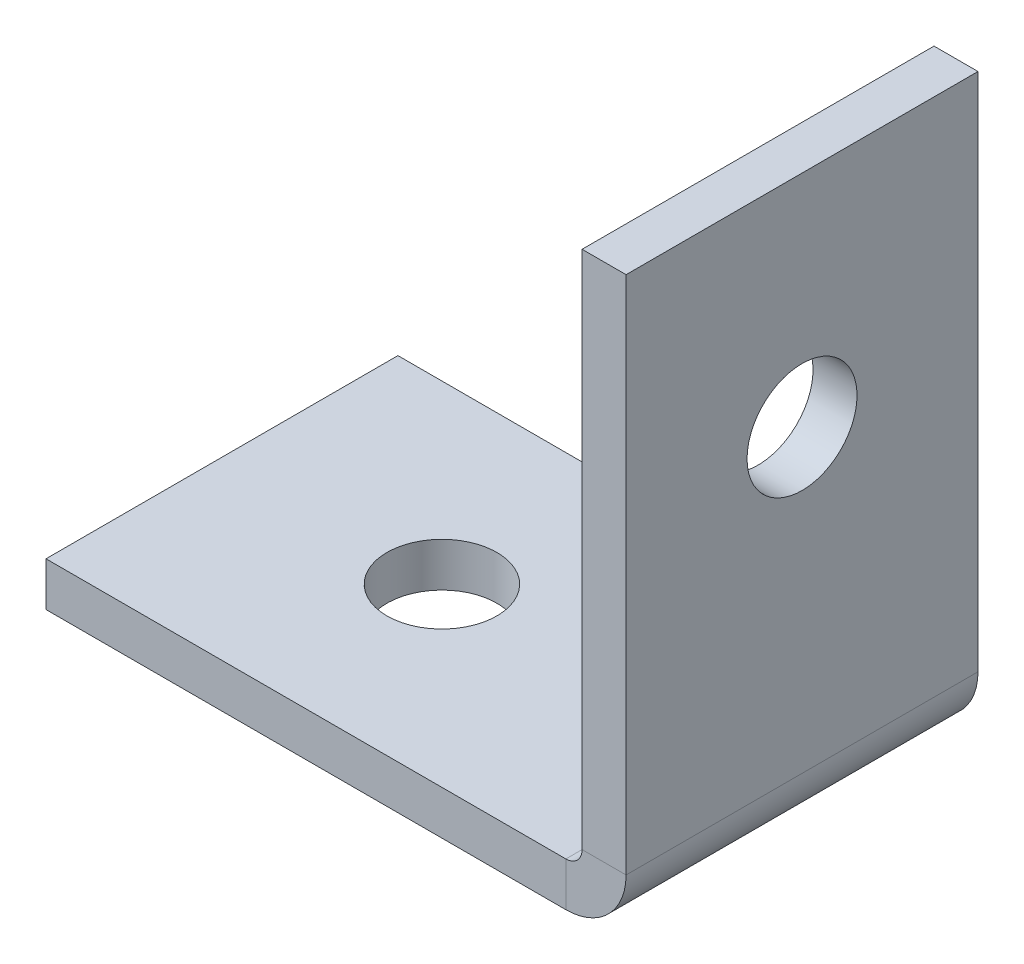
ISO-10303-21;
HEADER;
FILE_DESCRIPTION(('STEP AP214'),'2;1');
FILE_NAME('part.step','',(''),(''),'','','');
FILE_SCHEMA(('AUTOMOTIVE_DESIGN { 1 0 10303 214 1 1 1 1 }'));
ENDSEC;
DATA;
#1=APPLICATION_CONTEXT('core data for automotive mechanical design processes');
#2=APPLICATION_PROTOCOL_DEFINITION('international standard','automotive_design',2000,#1);
#3=PRODUCT_CONTEXT('',#1,'mechanical');
#4=PRODUCT('Part','Part','',(#3));
#5=PRODUCT_RELATED_PRODUCT_CATEGORY('part','',(#4));
#6=PRODUCT_DEFINITION_FORMATION('','',#4);
#7=PRODUCT_DEFINITION_CONTEXT('part definition',#1,'design');
#8=PRODUCT_DEFINITION('design','',#6,#7);
#9=PRODUCT_DEFINITION_SHAPE('','',#8);
#10=(LENGTH_UNIT() NAMED_UNIT(*) SI_UNIT(.MILLI.,.METRE.));
#11=(NAMED_UNIT(*) PLANE_ANGLE_UNIT() SI_UNIT($,.RADIAN.));
#12=(NAMED_UNIT(*) SI_UNIT($,.STERADIAN.) SOLID_ANGLE_UNIT());
#13=UNCERTAINTY_MEASURE_WITH_UNIT(LENGTH_MEASURE(1.E-05),#10,'distance_accuracy_value','');
#14=(GEOMETRIC_REPRESENTATION_CONTEXT(3) GLOBAL_UNCERTAINTY_ASSIGNED_CONTEXT((#13)) GLOBAL_UNIT_ASSIGNED_CONTEXT((#10,
#11,#12)) REPRESENTATION_CONTEXT('',''));
#15=CARTESIAN_POINT('',(0.,0.,0.));
#16=DIRECTION('',(0.,0.,1.));
#17=DIRECTION('',(1.,0.,0.));
#18=AXIS2_PLACEMENT_3D('',#15,#16,#17);
#19=CARTESIAN_POINT('',(-0.627322450556003,-0.627322450556014,0.));
#20=DIRECTION('',(1.,0.,0.));
#21=DIRECTION('',(0.,0.,-1.));
#22=AXIS2_PLACEMENT_3D('',#19,#20,#21);
#23=PLANE('',#22);
#24=CARTESIAN_POINT('',(-0.627322450556055,14.372677549444,0.));
#25=DIRECTION('',(-1.,0.,0.));
#26=DIRECTION('',(0.,0.,1.));
#27=AXIS2_PLACEMENT_3D('',#24,#25,#26);
#28=CIRCLE('',#27,2.5);
#29=CARTESIAN_POINT('',(-0.627322450556055,14.372677549444,2.5));
#30=VERTEX_POINT('',#29);
#31=EDGE_CURVE('E168',#30,#30,#28,.T.);
#32=ORIENTED_EDGE('',*,*,#31,.F.);
#33=EDGE_LOOP('',(#32));
#34=FACE_BOUND('',#33,.T.);
#35=DIRECTION('',(0.,-1.,0.));
#36=VECTOR('',#35,1.);
#37=CARTESIAN_POINT('',(-0.627322450555915,-25.627322450556,-8.00000000000001));
#38=LINE('',#37,#36);
#39=CARTESIAN_POINT('',(-0.62732245055609,24.372677549444,-8.00000000000001));
#40=VERTEX_POINT('',#39);
#41=CARTESIAN_POINT('',(-0.627322450556007,0.736600000000003,-8.00000000000001));
#42=VERTEX_POINT('',#41);
#43=EDGE_CURVE('E64',#40,#42,#38,.T.);
#44=ORIENTED_EDGE('',*,*,#43,.T.);
#45=DIRECTION('',(0.,0.,1.));
#46=VECTOR('',#45,1.);
#47=CARTESIAN_POINT('',(-0.627322450556007,0.736600000000001,0.));
#48=LINE('',#47,#46);
#49=CARTESIAN_POINT('',(-0.627322450556007,0.736600000000003,7.99999999999999));
#50=VERTEX_POINT('',#49);
#51=EDGE_CURVE('E56',#42,#50,#48,.T.);
#52=ORIENTED_EDGE('',*,*,#51,.T.);
#53=DIRECTION('',(0.,1.,0.));
#54=VECTOR('',#53,1.);
#55=CARTESIAN_POINT('',(-0.627322450555915,-25.627322450556,7.99999999999999));
#56=LINE('',#55,#54);
#57=CARTESIAN_POINT('',(-0.62732245055609,24.372677549444,7.99999999999999));
#58=VERTEX_POINT('',#57);
#59=EDGE_CURVE('E72',#50,#58,#56,.T.);
#60=ORIENTED_EDGE('',*,*,#59,.T.);
#61=DIRECTION('',(0.,0.,-1.));
#62=VECTOR('',#61,1.);
#63=CARTESIAN_POINT('',(-0.62732245055609,24.372677549444,7.99999999999999));
#64=LINE('',#63,#62);
#65=EDGE_CURVE('E167',#58,#40,#64,.T.);
#66=ORIENTED_EDGE('',*,*,#65,.T.);
#67=EDGE_LOOP('',(#44,#52,#60,#66));
#68=FACE_BOUND('',#67,.T.);
#69=ADVANCED_FACE('F47',(#34,#68),#23,.F.);
#70=CARTESIAN_POINT('',(1.37267754944391,24.372677549444,7.99999999999999));
#71=DIRECTION('',(0.,1.,0.));
#72=DIRECTION('',(0.,0.,-1.));
#73=AXIS2_PLACEMENT_3D('',#70,#71,#72);
#74=PLANE('',#73);
#75=ORIENTED_EDGE('',*,*,#65,.F.);
#76=DIRECTION('',(-1.,0.,0.));
#77=VECTOR('',#76,1.);
#78=CARTESIAN_POINT('',(1.37267754944391,24.372677549444,7.99999999999999));
#79=LINE('',#78,#77);
#80=CARTESIAN_POINT('',(1.37267754944391,24.372677549444,7.99999999999999));
#81=VERTEX_POINT('',#80);
#82=EDGE_CURVE('E177',#81,#58,#79,.T.);
#83=ORIENTED_EDGE('',*,*,#82,.F.);
#84=DIRECTION('',(0.,0.,-1.));
#85=VECTOR('',#84,1.);
#86=CARTESIAN_POINT('',(1.37267754944391,24.372677549444,7.99999999999999));
#87=LINE('',#86,#85);
#88=CARTESIAN_POINT('',(1.37267754944391,24.372677549444,-8.00000000000001));
#89=VERTEX_POINT('',#88);
#90=EDGE_CURVE('E172',#81,#89,#87,.T.);
#91=ORIENTED_EDGE('',*,*,#90,.T.);
#92=DIRECTION('',(-1.,0.,0.));
#93=VECTOR('',#92,1.);
#94=CARTESIAN_POINT('',(1.37267754944391,24.372677549444,-8.00000000000001));
#95=LINE('',#94,#93);
#96=EDGE_CURVE('E179',#89,#40,#95,.T.);
#97=ORIENTED_EDGE('',*,*,#96,.T.);
#98=EDGE_LOOP('',(#75,#83,#91,#97));
#99=FACE_BOUND('',#98,.T.);
#100=ADVANCED_FACE('F194',(#99),#74,.T.);
#101=CARTESIAN_POINT('',(1.37267754944408,-25.627322450556,7.99999999999999));
#102=DIRECTION('',(0.,0.,1.));
#103=DIRECTION('',(0.,1.,0.));
#104=AXIS2_PLACEMENT_3D('',#101,#102,#103);
#105=PLANE('',#104);
#106=DIRECTION('',(-1.,0.,0.));
#107=VECTOR('',#106,1.);
#108=CARTESIAN_POINT('',(1.37267754944399,0.73660000000001,7.99999999999999));
#109=LINE('',#108,#107);
#110=CARTESIAN_POINT('',(1.37267754944399,0.736600000000013,7.99999999999999));
#111=VERTEX_POINT('',#110);
#112=EDGE_CURVE('E182',#111,#50,#109,.T.);
#113=ORIENTED_EDGE('',*,*,#112,.F.);
#114=DIRECTION('',(0.,1.,0.));
#115=VECTOR('',#114,1.);
#116=CARTESIAN_POINT('',(1.37267754944408,-25.627322450556,7.99999999999999));
#117=LINE('',#116,#115);
#118=EDGE_CURVE('E51',#111,#81,#117,.T.);
#119=ORIENTED_EDGE('',*,*,#118,.T.);
#120=ORIENTED_EDGE('',*,*,#82,.T.);
#121=ORIENTED_EDGE('',*,*,#59,.F.);
#122=EDGE_LOOP('',(#113,#119,#120,#121));
#123=FACE_BOUND('',#122,.T.);
#124=ADVANCED_FACE('F190',(#123),#105,.T.);
#125=CARTESIAN_POINT('',(1.37267754944408,-25.627322450556,-8.00000000000001));
#126=DIRECTION('',(0.,0.,-1.));
#127=DIRECTION('',(0.,-1.,0.));
#128=AXIS2_PLACEMENT_3D('',#125,#126,#127);
#129=PLANE('',#128);
#130=DIRECTION('',(1.,0.,0.));
#131=VECTOR('',#130,1.);
#132=CARTESIAN_POINT('',(1.37267754944399,0.73660000000001,-8.00000000000001));
#133=LINE('',#132,#131);
#134=CARTESIAN_POINT('',(1.37267754944399,0.73660000000001,-8.00000000000001));
#135=VERTEX_POINT('',#134);
#136=EDGE_CURVE('E12',#42,#135,#133,.T.);
#137=ORIENTED_EDGE('',*,*,#136,.F.);
#138=ORIENTED_EDGE('',*,*,#43,.F.);
#139=ORIENTED_EDGE('',*,*,#96,.F.);
#140=DIRECTION('',(0.,-1.,0.));
#141=VECTOR('',#140,1.);
#142=CARTESIAN_POINT('',(1.37267754944408,-25.627322450556,-8.00000000000001));
#143=LINE('',#142,#141);
#144=EDGE_CURVE('E175',#89,#135,#143,.T.);
#145=ORIENTED_EDGE('',*,*,#144,.T.);
#146=EDGE_LOOP('',(#137,#138,#139,#145));
#147=FACE_BOUND('',#146,.T.);
#148=ADVANCED_FACE('F49',(#147),#129,.T.);
#149=CARTESIAN_POINT('',(1.372677549444,-0.627322450556007,0.));
#150=DIRECTION('',(1.,0.,0.));
#151=DIRECTION('',(0.,0.,-1.));
#152=AXIS2_PLACEMENT_3D('',#149,#150,#151);
#153=PLANE('',#152);
#154=DIRECTION('',(0.,0.,1.));
#155=VECTOR('',#154,1.);
#156=CARTESIAN_POINT('',(1.37267754944399,0.736600000000008,0.));
#157=LINE('',#156,#155);
#158=EDGE_CURVE('E136',#135,#111,#157,.T.);
#159=ORIENTED_EDGE('',*,*,#158,.F.);
#160=ORIENTED_EDGE('',*,*,#144,.F.);
#161=ORIENTED_EDGE('',*,*,#90,.F.);
#162=ORIENTED_EDGE('',*,*,#118,.F.);
#163=EDGE_LOOP('',(#159,#160,#161,#162));
#164=FACE_BOUND('',#163,.T.);
#165=CARTESIAN_POINT('',(1.37267754944394,14.372677549444,0.));
#166=DIRECTION('',(-1.,0.,0.));
#167=DIRECTION('',(0.,0.,1.));
#168=AXIS2_PLACEMENT_3D('',#165,#166,#167);
#169=CIRCLE('',#168,2.5);
#170=CARTESIAN_POINT('',(1.37267754944394,14.372677549444,2.5));
#171=VERTEX_POINT('',#170);
#172=EDGE_CURVE('E164',#171,#171,#169,.T.);
#173=ORIENTED_EDGE('',*,*,#172,.T.);
#174=EDGE_LOOP('',(#173));
#175=FACE_BOUND('',#174,.T.);
#176=ADVANCED_FACE('F239',(#164,#175),#153,.T.);
#177=CARTESIAN_POINT('',(1.37267754944394,14.372677549444,0.));
#178=DIRECTION('',(-1.,0.,0.));
#179=DIRECTION('',(0.,0.,1.));
#180=AXIS2_PLACEMENT_3D('',#177,#178,#179);
#181=CYLINDRICAL_SURFACE('',#180,2.5);
#182=ORIENTED_EDGE('',*,*,#172,.F.);
#183=EDGE_LOOP('',(#182));
#184=FACE_BOUND('',#183,.T.);
#185=ORIENTED_EDGE('',*,*,#31,.T.);
#186=EDGE_LOOP('',(#185));
#187=FACE_BOUND('',#186,.T.);
#188=ADVANCED_FACE('F231',(#184,#187),#181,.F.);
#189=CARTESIAN_POINT('',(-25.,-2.,7.99999999999999));
#190=DIRECTION('',(-1.,0.,0.));
#191=DIRECTION('',(0.,0.,1.));
#192=AXIS2_PLACEMENT_3D('',#189,#190,#191);
#193=PLANE('',#192);
#194=DIRECTION('',(0.,0.,1.));
#195=VECTOR('',#194,1.);
#196=CARTESIAN_POINT('',(-25.,0.,7.99999999999999));
#197=LINE('',#196,#195);
#198=CARTESIAN_POINT('',(-25.,0.,-8.00000000000001));
#199=VERTEX_POINT('',#198);
#200=CARTESIAN_POINT('',(-25.,0.,7.99999999999999));
#201=VERTEX_POINT('',#200);
#202=EDGE_CURVE('E217',#199,#201,#197,.T.);
#203=ORIENTED_EDGE('',*,*,#202,.F.);
#204=DIRECTION('',(0.,1.,0.));
#205=VECTOR('',#204,1.);
#206=CARTESIAN_POINT('',(-25.,-2.,-8.00000000000001));
#207=LINE('',#206,#205);
#208=CARTESIAN_POINT('',(-25.,-2.,-8.00000000000001));
#209=VERTEX_POINT('',#208);
#210=EDGE_CURVE('E171',#209,#199,#207,.T.);
#211=ORIENTED_EDGE('',*,*,#210,.F.);
#212=DIRECTION('',(0.,0.,1.));
#213=VECTOR('',#212,1.);
#214=CARTESIAN_POINT('',(-25.,-2.,7.99999999999999));
#215=LINE('',#214,#213);
#216=CARTESIAN_POINT('',(-25.,-2.,7.99999999999999));
#217=VERTEX_POINT('',#216);
#218=EDGE_CURVE('E161',#209,#217,#215,.T.);
#219=ORIENTED_EDGE('',*,*,#218,.T.);
#220=DIRECTION('',(0.,1.,0.));
#221=VECTOR('',#220,1.);
#222=CARTESIAN_POINT('',(-25.,-2.,7.99999999999999));
#223=LINE('',#222,#221);
#224=EDGE_CURVE('E150',#217,#201,#223,.T.);
#225=ORIENTED_EDGE('',*,*,#224,.T.);
#226=EDGE_LOOP('',(#203,#211,#219,#225));
#227=FACE_BOUND('',#226,.T.);
#228=ADVANCED_FACE('F228',(#227),#193,.T.);
#229=CARTESIAN_POINT('',(-15.,-2.,0.));
#230=DIRECTION('',(0.,1.,0.));
#231=DIRECTION('',(0.,0.,1.));
#232=AXIS2_PLACEMENT_3D('',#229,#230,#231);
#233=CYLINDRICAL_SURFACE('',#232,2.5);
#234=CARTESIAN_POINT('',(-15.,-2.,0.));
#235=DIRECTION('',(0.,1.,0.));
#236=DIRECTION('',(0.,0.,1.));
#237=AXIS2_PLACEMENT_3D('',#234,#235,#236);
#238=CIRCLE('',#237,2.5);
#239=CARTESIAN_POINT('',(-15.,-2.,2.50000000000001));
#240=VERTEX_POINT('',#239);
#241=EDGE_CURVE('E147',#240,#240,#238,.T.);
#242=ORIENTED_EDGE('',*,*,#241,.F.);
#243=EDGE_LOOP('',(#242));
#244=FACE_BOUND('',#243,.T.);
#245=CARTESIAN_POINT('',(-15.,0.,0.));
#246=DIRECTION('',(0.,1.,0.));
#247=DIRECTION('',(0.,0.,1.));
#248=AXIS2_PLACEMENT_3D('',#245,#246,#247);
#249=CIRCLE('',#248,2.5);
#250=CARTESIAN_POINT('',(-15.,0.,2.50000000000001));
#251=VERTEX_POINT('',#250);
#252=EDGE_CURVE('E157',#251,#251,#249,.T.);
#253=ORIENTED_EDGE('',*,*,#252,.T.);
#254=EDGE_LOOP('',(#253));
#255=FACE_BOUND('',#254,.T.);
#256=ADVANCED_FACE('F230',(#244,#255),#233,.F.);
#257=CARTESIAN_POINT('',(0.,-2.,0.));
#258=DIRECTION('',(0.,-1.,0.));
#259=DIRECTION('',(0.,0.,-1.));
#260=AXIS2_PLACEMENT_3D('',#257,#258,#259);
#261=PLANE('',#260);
#262=ORIENTED_EDGE('',*,*,#241,.T.);
#263=EDGE_LOOP('',(#262));
#264=FACE_BOUND('',#263,.T.);
#265=DIRECTION('',(-1.,0.,0.));
#266=VECTOR('',#265,1.);
#267=CARTESIAN_POINT('',(-25.,-2.,-8.00000000000001));
#268=LINE('',#267,#266);
#269=CARTESIAN_POINT('',(-1.36392245055601,-2.,-8.00000000000001));
#270=VERTEX_POINT('',#269);
#271=EDGE_CURVE('E145',#270,#209,#268,.T.);
#272=ORIENTED_EDGE('',*,*,#271,.F.);
#273=DIRECTION('',(0.,0.,1.));
#274=VECTOR('',#273,1.);
#275=CARTESIAN_POINT('',(-1.36392245055601,-2.,0.));
#276=LINE('',#275,#274);
#277=CARTESIAN_POINT('',(-1.36392245055601,-2.,7.99999999999999));
#278=VERTEX_POINT('',#277);
#279=EDGE_CURVE('E134',#270,#278,#276,.T.);
#280=ORIENTED_EDGE('',*,*,#279,.T.);
#281=DIRECTION('',(1.,0.,0.));
#282=VECTOR('',#281,1.);
#283=CARTESIAN_POINT('',(-25.,-2.,7.99999999999999));
#284=LINE('',#283,#282);
#285=EDGE_CURVE('E127',#217,#278,#284,.T.);
#286=ORIENTED_EDGE('',*,*,#285,.F.);
#287=ORIENTED_EDGE('',*,*,#218,.F.);
#288=EDGE_LOOP('',(#272,#280,#286,#287));
#289=FACE_BOUND('',#288,.T.);
#290=ADVANCED_FACE('F143',(#264,#289),#261,.T.);
#291=CARTESIAN_POINT('',(-25.,-2.,7.99999999999999));
#292=DIRECTION('',(0.,0.,1.));
#293=DIRECTION('',(1.,0.,0.));
#294=AXIS2_PLACEMENT_3D('',#291,#292,#293);
#295=PLANE('',#294);
#296=ORIENTED_EDGE('',*,*,#285,.T.);
#297=DIRECTION('',(0.,1.,0.));
#298=VECTOR('',#297,1.);
#299=CARTESIAN_POINT('',(-1.36392245055601,-2.,7.99999999999999));
#300=LINE('',#299,#298);
#301=CARTESIAN_POINT('',(-1.36392245055601,0.,7.99999999999999));
#302=VERTEX_POINT('',#301);
#303=EDGE_CURVE('E115',#278,#302,#300,.T.);
#304=ORIENTED_EDGE('',*,*,#303,.T.);
#305=DIRECTION('',(1.,0.,0.));
#306=VECTOR('',#305,1.);
#307=CARTESIAN_POINT('',(-25.,0.,7.99999999999999));
#308=LINE('',#307,#306);
#309=EDGE_CURVE('E214',#201,#302,#308,.T.);
#310=ORIENTED_EDGE('',*,*,#309,.F.);
#311=ORIENTED_EDGE('',*,*,#224,.F.);
#312=EDGE_LOOP('',(#296,#304,#310,#311));
#313=FACE_BOUND('',#312,.T.);
#314=ADVANCED_FACE('F149',(#313),#295,.T.);
#315=CARTESIAN_POINT('',(0.,0.,0.));
#316=DIRECTION('',(0.,-1.,0.));
#317=DIRECTION('',(0.,0.,-1.));
#318=AXIS2_PLACEMENT_3D('',#315,#316,#317);
#319=PLANE('',#318);
#320=DIRECTION('',(0.,0.,1.));
#321=VECTOR('',#320,1.);
#322=CARTESIAN_POINT('',(-1.36392245055601,0.,0.));
#323=LINE('',#322,#321);
#324=CARTESIAN_POINT('',(-1.36392245055601,0.,-8.00000000000001));
#325=VERTEX_POINT('',#324);
#326=EDGE_CURVE('E137',#325,#302,#323,.T.);
#327=ORIENTED_EDGE('',*,*,#326,.F.);
#328=DIRECTION('',(-1.,0.,0.));
#329=VECTOR('',#328,1.);
#330=CARTESIAN_POINT('',(-25.,0.,-8.00000000000001));
#331=LINE('',#330,#329);
#332=EDGE_CURVE('E126',#325,#199,#331,.T.);
#333=ORIENTED_EDGE('',*,*,#332,.T.);
#334=ORIENTED_EDGE('',*,*,#202,.T.);
#335=ORIENTED_EDGE('',*,*,#309,.T.);
#336=EDGE_LOOP('',(#327,#333,#334,#335));
#337=FACE_BOUND('',#336,.T.);
#338=ORIENTED_EDGE('',*,*,#252,.F.);
#339=EDGE_LOOP('',(#338));
#340=FACE_BOUND('',#339,.T.);
#341=ADVANCED_FACE('F221',(#337,#340),#319,.F.);
#342=CARTESIAN_POINT('',(-25.,-2.,-8.00000000000001));
#343=DIRECTION('',(0.,0.,-1.));
#344=DIRECTION('',(-1.,0.,0.));
#345=AXIS2_PLACEMENT_3D('',#342,#343,#344);
#346=PLANE('',#345);
#347=ORIENTED_EDGE('',*,*,#332,.F.);
#348=DIRECTION('',(0.,-1.,0.));
#349=VECTOR('',#348,1.);
#350=CARTESIAN_POINT('',(-1.36392245055601,-2.,-8.00000000000001));
#351=LINE('',#350,#349);
#352=EDGE_CURVE('E205',#325,#270,#351,.T.);
#353=ORIENTED_EDGE('',*,*,#352,.T.);
#354=ORIENTED_EDGE('',*,*,#271,.T.);
#355=ORIENTED_EDGE('',*,*,#210,.T.);
#356=EDGE_LOOP('',(#347,#353,#354,#355));
#357=FACE_BOUND('',#356,.T.);
#358=ADVANCED_FACE('F226',(#357),#346,.T.);
#359=CARTESIAN_POINT('',(-1.36392245055601,0.7366,-8.00000000000001));
#360=DIRECTION('',(0.,0.,-1.));
#361=DIRECTION('',(-1.,0.,0.));
#362=AXIS2_PLACEMENT_3D('',#359,#360,#361);
#363=PLANE('',#362);
#364=ORIENTED_EDGE('',*,*,#352,.F.);
#365=CARTESIAN_POINT('',(-1.36392245055601,0.7366,-8.00000000000001));
#366=DIRECTION('',(0.,0.,1.));
#367=DIRECTION('',(1.,0.,0.));
#368=AXIS2_PLACEMENT_3D('',#365,#366,#367);
#369=CIRCLE('',#368,0.7366);
#370=EDGE_CURVE('E202',#325,#42,#369,.T.);
#371=ORIENTED_EDGE('',*,*,#370,.T.);
#372=ORIENTED_EDGE('',*,*,#136,.T.);
#373=CARTESIAN_POINT('',(-1.36392245055601,0.7366,-8.00000000000001));
#374=DIRECTION('',(0.,0.,1.));
#375=DIRECTION('',(-1.,0.,0.));
#376=AXIS2_PLACEMENT_3D('',#373,#374,#375);
#377=CIRCLE('',#376,2.7366);
#378=EDGE_CURVE('E138',#270,#135,#377,.T.);
#379=ORIENTED_EDGE('',*,*,#378,.F.);
#380=EDGE_LOOP('',(#364,#371,#372,#379));
#381=FACE_BOUND('',#380,.T.);
#382=ADVANCED_FACE('F204',(#381),#363,.T.);
#383=CARTESIAN_POINT('',(-1.36392245055601,0.7366,7.99999999999999));
#384=DIRECTION('',(0.,0.,1.));
#385=DIRECTION('',(1.,0.,0.));
#386=AXIS2_PLACEMENT_3D('',#383,#384,#385);
#387=PLANE('',#386);
#388=CARTESIAN_POINT('',(-1.36392245055601,0.7366,7.99999999999999));
#389=DIRECTION('',(0.,0.,1.));
#390=DIRECTION('',(1.,0.,0.));
#391=AXIS2_PLACEMENT_3D('',#388,#389,#390);
#392=CIRCLE('',#391,0.7366);
#393=EDGE_CURVE('E121',#50,#302,#392,.F.);
#394=ORIENTED_EDGE('',*,*,#393,.T.);
#395=ORIENTED_EDGE('',*,*,#303,.F.);
#396=CARTESIAN_POINT('',(-1.36392245055601,0.7366,7.99999999999999));
#397=DIRECTION('',(0.,0.,-1.));
#398=DIRECTION('',(1.,0.,0.));
#399=AXIS2_PLACEMENT_3D('',#396,#397,#398);
#400=CIRCLE('',#399,2.7366);
#401=EDGE_CURVE('E119',#111,#278,#400,.T.);
#402=ORIENTED_EDGE('',*,*,#401,.F.);
#403=ORIENTED_EDGE('',*,*,#112,.T.);
#404=EDGE_LOOP('',(#394,#395,#402,#403));
#405=FACE_BOUND('',#404,.T.);
#406=ADVANCED_FACE('F117',(#405),#387,.T.);
#407=CARTESIAN_POINT('',(-1.36392245055601,0.7366,-16.3536276649716));
#408=DIRECTION('',(0.,0.,1.));
#409=DIRECTION('',(1.,0.,0.));
#410=AXIS2_PLACEMENT_3D('',#407,#408,#409);
#411=CYLINDRICAL_SURFACE('',#410,2.7366);
#412=ORIENTED_EDGE('',*,*,#158,.T.);
#413=ORIENTED_EDGE('',*,*,#401,.T.);
#414=ORIENTED_EDGE('',*,*,#279,.F.);
#415=ORIENTED_EDGE('',*,*,#378,.T.);
#416=EDGE_LOOP('',(#412,#413,#414,#415));
#417=FACE_BOUND('',#416,.T.);
#418=ADVANCED_FACE('F132',(#417),#411,.T.);
#419=CARTESIAN_POINT('',(-1.36392245055601,0.7366,-16.3536276649716));
#420=DIRECTION('',(0.,0.,1.));
#421=DIRECTION('',(1.,0.,0.));
#422=AXIS2_PLACEMENT_3D('',#419,#420,#421);
#423=CYLINDRICAL_SURFACE('',#422,0.7366);
#424=ORIENTED_EDGE('',*,*,#51,.F.);
#425=ORIENTED_EDGE('',*,*,#370,.F.);
#426=ORIENTED_EDGE('',*,*,#326,.T.);
#427=ORIENTED_EDGE('',*,*,#393,.F.);
#428=EDGE_LOOP('',(#424,#425,#426,#427));
#429=FACE_BOUND('',#428,.T.);
#430=ADVANCED_FACE('F201',(#429),#423,.F.);
#431=CLOSED_SHELL('',(#69,#100,#124,#148,#176,#188,#228,#256,#290,#314,#341,#358,#382,#406,#418,#430));
#432=MANIFOLD_SOLID_BREP('B2',#431);
#433=ADVANCED_BREP_SHAPE_REPRESENTATION('',(#18,#432),#14);
#434=SHAPE_DEFINITION_REPRESENTATION(#9,#433);
ENDSEC;
END-ISO-10303-21;
